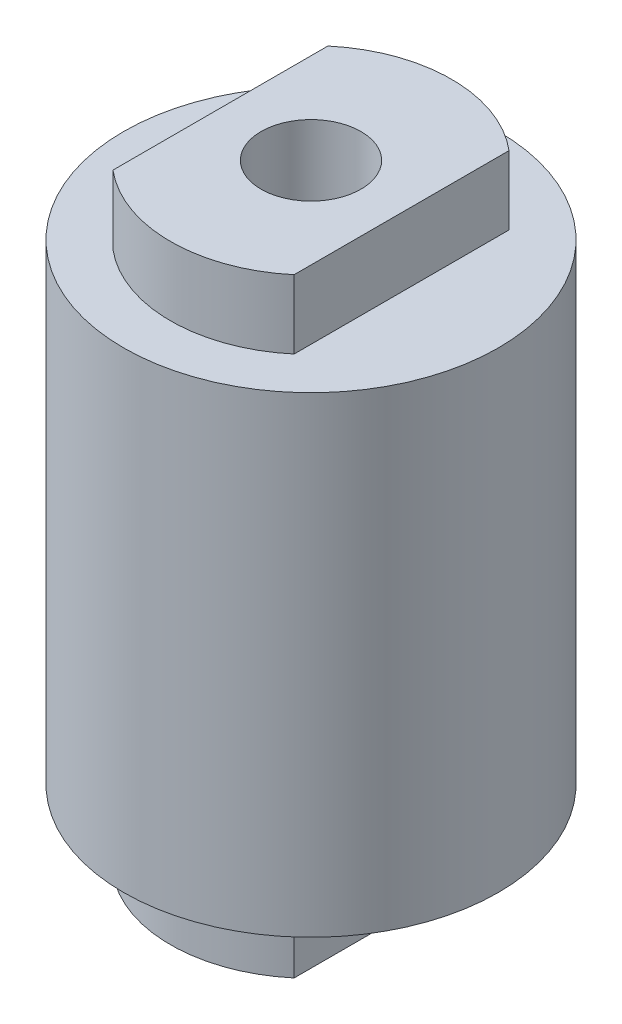
ISO-10303-21;
HEADER;
FILE_DESCRIPTION(('STEP AP214'),'2;1');
FILE_NAME('part.step','',(''),(''),'','','');
FILE_SCHEMA(('AUTOMOTIVE_DESIGN { 1 0 10303 214 1 1 1 1 }'));
ENDSEC;
DATA;
#1=APPLICATION_CONTEXT('core data for automotive mechanical design processes');
#2=APPLICATION_PROTOCOL_DEFINITION('international standard','automotive_design',2000,#1);
#3=PRODUCT_CONTEXT('',#1,'mechanical');
#4=PRODUCT('Part','Part','',(#3));
#5=PRODUCT_RELATED_PRODUCT_CATEGORY('part','',(#4));
#6=PRODUCT_DEFINITION_FORMATION('','',#4);
#7=PRODUCT_DEFINITION_CONTEXT('part definition',#1,'design');
#8=PRODUCT_DEFINITION('design','',#6,#7);
#9=PRODUCT_DEFINITION_SHAPE('','',#8);
#10=(LENGTH_UNIT() NAMED_UNIT(*) SI_UNIT(.MILLI.,.METRE.));
#11=(NAMED_UNIT(*) PLANE_ANGLE_UNIT() SI_UNIT($,.RADIAN.));
#12=(NAMED_UNIT(*) SI_UNIT($,.STERADIAN.) SOLID_ANGLE_UNIT());
#13=UNCERTAINTY_MEASURE_WITH_UNIT(LENGTH_MEASURE(1.E-05),#10,'distance_accuracy_value','');
#14=(GEOMETRIC_REPRESENTATION_CONTEXT(3) GLOBAL_UNCERTAINTY_ASSIGNED_CONTEXT((#13)) GLOBAL_UNIT_ASSIGNED_CONTEXT((#10,
#11,#12)) REPRESENTATION_CONTEXT('',''));
#15=CARTESIAN_POINT('',(0.,0.,0.));
#16=DIRECTION('',(0.,0.,1.));
#17=DIRECTION('',(1.,0.,0.));
#18=AXIS2_PLACEMENT_3D('',#15,#16,#17);
#19=CARTESIAN_POINT('',(0.,9.75,0.));
#20=DIRECTION('',(0.,1.,0.));
#21=DIRECTION('',(-1.,0.,0.));
#22=AXIS2_PLACEMENT_3D('',#19,#20,#21);
#23=CYLINDRICAL_SURFACE('',#22,4.5);
#24=DIRECTION('',(0.,1.,0.));
#25=VECTOR('',#24,1.);
#26=CARTESIAN_POINT('',(-2.9,7.55,3.44093010681705));
#27=LINE('',#26,#25);
#28=CARTESIAN_POINT('',(-2.9,7.55,3.44093010681705));
#29=VERTEX_POINT('',#28);
#30=CARTESIAN_POINT('',(-2.9,9.75,3.44093010681705));
#31=VERTEX_POINT('',#30);
#32=EDGE_CURVE('E191',#29,#31,#27,.T.);
#33=ORIENTED_EDGE('',*,*,#32,.F.);
#34=CARTESIAN_POINT('',(0.,7.55,0.));
#35=DIRECTION('',(0.,1.,0.));
#36=DIRECTION('',(-1.,0.,0.));
#37=AXIS2_PLACEMENT_3D('',#34,#35,#36);
#38=CIRCLE('',#37,4.5);
#39=CARTESIAN_POINT('',(2.9,7.55,3.44093010681705));
#40=VERTEX_POINT('',#39);
#41=EDGE_CURVE('E186',#29,#40,#38,.T.);
#42=ORIENTED_EDGE('',*,*,#41,.T.);
#43=DIRECTION('',(0.,1.,0.));
#44=VECTOR('',#43,1.);
#45=CARTESIAN_POINT('',(2.9,7.55,3.44093010681705));
#46=LINE('',#45,#44);
#47=CARTESIAN_POINT('',(2.9,9.75,3.44093010681705));
#48=VERTEX_POINT('',#47);
#49=EDGE_CURVE('E189',#40,#48,#46,.T.);
#50=ORIENTED_EDGE('',*,*,#49,.T.);
#51=CARTESIAN_POINT('',(0.,9.75,0.));
#52=DIRECTION('',(0.,1.,0.));
#53=DIRECTION('',(-1.,0.,0.));
#54=AXIS2_PLACEMENT_3D('',#51,#52,#53);
#55=CIRCLE('',#54,4.5);
#56=EDGE_CURVE('E218',#31,#48,#55,.T.);
#57=ORIENTED_EDGE('',*,*,#56,.F.);
#58=EDGE_LOOP('',(#33,#42,#50,#57));
#59=FACE_BOUND('',#58,.T.);
#60=ADVANCED_FACE('F49',(#59),#23,.T.);
#61=DIRECTION('',(0.,1.,0.));
#62=VECTOR('',#61,1.);
#63=CARTESIAN_POINT('',(2.9,7.55,-3.44093010681705));
#64=LINE('',#63,#62);
#65=CARTESIAN_POINT('',(2.9,7.55,-3.44093010681705));
#66=VERTEX_POINT('',#65);
#67=CARTESIAN_POINT('',(2.9,9.75,-3.44093010681705));
#68=VERTEX_POINT('',#67);
#69=EDGE_CURVE('E207',#66,#68,#64,.T.);
#70=ORIENTED_EDGE('',*,*,#69,.F.);
#71=CARTESIAN_POINT('',(-2.9,7.55,-3.44093010681705));
#72=VERTEX_POINT('',#71);
#73=EDGE_CURVE('E197',#66,#72,#38,.T.);
#74=ORIENTED_EDGE('',*,*,#73,.T.);
#75=DIRECTION('',(0.,1.,0.));
#76=VECTOR('',#75,1.);
#77=CARTESIAN_POINT('',(-2.9,7.55,-3.44093010681705));
#78=LINE('',#77,#76);
#79=CARTESIAN_POINT('',(-2.9,9.75,-3.44093010681705));
#80=VERTEX_POINT('',#79);
#81=EDGE_CURVE('E216',#72,#80,#78,.T.);
#82=ORIENTED_EDGE('',*,*,#81,.T.);
#83=EDGE_CURVE('E219',#68,#80,#55,.T.);
#84=ORIENTED_EDGE('',*,*,#83,.F.);
#85=EDGE_LOOP('',(#70,#74,#82,#84));
#86=FACE_BOUND('',#85,.T.);
#87=ADVANCED_FACE('F396',(#86),#23,.T.);
#88=DIRECTION('',(0.,-1.,0.));
#89=VECTOR('',#88,1.);
#90=CARTESIAN_POINT('',(2.9,-7.55,3.44093010681705));
#91=LINE('',#90,#89);
#92=CARTESIAN_POINT('',(2.9,-7.55,3.44093010681705));
#93=VERTEX_POINT('',#92);
#94=CARTESIAN_POINT('',(2.9,-9.74999999999999,3.44093010681705));
#95=VERTEX_POINT('',#94);
#96=EDGE_CURVE('E72',#93,#95,#91,.T.);
#97=ORIENTED_EDGE('',*,*,#96,.F.);
#98=CARTESIAN_POINT('',(0.,-7.55,0.));
#99=DIRECTION('',(0.,-1.,0.));
#100=DIRECTION('',(1.,0.,0.));
#101=AXIS2_PLACEMENT_3D('',#98,#99,#100);
#102=CIRCLE('',#101,4.5);
#103=CARTESIAN_POINT('',(-2.9,-7.55,3.44093010681705));
#104=VERTEX_POINT('',#103);
#105=EDGE_CURVE('E359',#104,#93,#102,.F.);
#106=ORIENTED_EDGE('',*,*,#105,.F.);
#107=DIRECTION('',(0.,-1.,0.));
#108=VECTOR('',#107,1.);
#109=CARTESIAN_POINT('',(-2.9,-7.55,3.44093010681705));
#110=LINE('',#109,#108);
#111=CARTESIAN_POINT('',(-2.9,-9.75,3.44093010681705));
#112=VERTEX_POINT('',#111);
#113=EDGE_CURVE('E296',#104,#112,#110,.T.);
#114=ORIENTED_EDGE('',*,*,#113,.T.);
#115=CARTESIAN_POINT('',(0.,-9.75,0.));
#116=DIRECTION('',(0.,1.,0.));
#117=DIRECTION('',(-1.,0.,0.));
#118=AXIS2_PLACEMENT_3D('',#115,#116,#117);
#119=CIRCLE('',#118,4.5);
#120=EDGE_CURVE('E12',#112,#95,#119,.T.);
#121=ORIENTED_EDGE('',*,*,#120,.T.);
#122=EDGE_LOOP('',(#97,#106,#114,#121));
#123=FACE_BOUND('',#122,.T.);
#124=ADVANCED_FACE('F374',(#123),#23,.T.);
#125=CARTESIAN_POINT('',(0.,-9.75,0.));
#126=DIRECTION('',(0.,1.,0.));
#127=DIRECTION('',(-1.,0.,0.));
#128=AXIS2_PLACEMENT_3D('',#125,#126,#127);
#129=CYLINDRICAL_SURFACE('',#128,1.6);
#130=CARTESIAN_POINT('',(0.,2.75,0.));
#131=DIRECTION('',(0.,1.,0.));
#132=DIRECTION('',(-1.,0.,0.));
#133=AXIS2_PLACEMENT_3D('',#130,#131,#132);
#134=CIRCLE('',#133,1.6);
#135=CARTESIAN_POINT('',(-1.6,2.75,0.));
#136=VERTEX_POINT('',#135);
#137=EDGE_CURVE('E269',#136,#136,#134,.F.);
#138=ORIENTED_EDGE('',*,*,#137,.F.);
#139=EDGE_LOOP('',(#138));
#140=FACE_BOUND('',#139,.T.);
#141=CARTESIAN_POINT('',(0.,-2.75,0.));
#142=DIRECTION('',(0.,1.,0.));
#143=DIRECTION('',(-1.,0.,0.));
#144=AXIS2_PLACEMENT_3D('',#141,#142,#143);
#145=CIRCLE('',#144,1.6);
#146=CARTESIAN_POINT('',(-1.6,-2.75,0.));
#147=VERTEX_POINT('',#146);
#148=EDGE_CURVE('E334',#147,#147,#145,.F.);
#149=ORIENTED_EDGE('',*,*,#148,.T.);
#150=EDGE_LOOP('',(#149));
#151=FACE_BOUND('',#150,.T.);
#152=ADVANCED_FACE('F382',(#140,#151),#129,.F.);
#153=DIRECTION('',(0.,-1.,0.));
#154=VECTOR('',#153,1.);
#155=CARTESIAN_POINT('',(-2.9,-7.55,-3.44093010681705));
#156=LINE('',#155,#154);
#157=CARTESIAN_POINT('',(-2.9,-7.55,-3.44093010681705));
#158=VERTEX_POINT('',#157);
#159=CARTESIAN_POINT('',(-2.9,-9.75,-3.44093010681705));
#160=VERTEX_POINT('',#159);
#161=EDGE_CURVE('E64',#158,#160,#156,.T.);
#162=ORIENTED_EDGE('',*,*,#161,.F.);
#163=CARTESIAN_POINT('',(2.9,-7.55,-3.44093010681705));
#164=VERTEX_POINT('',#163);
#165=EDGE_CURVE('E337',#164,#158,#102,.F.);
#166=ORIENTED_EDGE('',*,*,#165,.F.);
#167=DIRECTION('',(0.,-1.,0.));
#168=VECTOR('',#167,1.);
#169=CARTESIAN_POINT('',(2.9,-7.55,-3.44093010681705));
#170=LINE('',#169,#168);
#171=CARTESIAN_POINT('',(2.9,-9.75,-3.44093010681705));
#172=VERTEX_POINT('',#171);
#173=EDGE_CURVE('E287',#164,#172,#170,.T.);
#174=ORIENTED_EDGE('',*,*,#173,.T.);
#175=EDGE_CURVE('E57',#172,#160,#119,.T.);
#176=ORIENTED_EDGE('',*,*,#175,.T.);
#177=EDGE_LOOP('',(#162,#166,#174,#176));
#178=FACE_BOUND('',#177,.T.);
#179=ADVANCED_FACE('F380',(#178),#23,.T.);
#180=CARTESIAN_POINT('',(0.,-9.75,0.));
#181=DIRECTION('',(0.,1.,0.));
#182=DIRECTION('',(-1.,0.,0.));
#183=AXIS2_PLACEMENT_3D('',#180,#181,#182);
#184=PLANE('',#183);
#185=CARTESIAN_POINT('',(0.,-9.75,0.));
#186=DIRECTION('',(0.,1.,0.));
#187=DIRECTION('',(-1.,0.,0.));
#188=AXIS2_PLACEMENT_3D('',#185,#186,#187);
#189=CIRCLE('',#188,1.6);
#190=CARTESIAN_POINT('',(-1.6,-9.75,0.));
#191=VERTEX_POINT('',#190);
#192=EDGE_CURVE('E213',#191,#191,#189,.T.);
#193=ORIENTED_EDGE('',*,*,#192,.T.);
#194=EDGE_LOOP('',(#193));
#195=FACE_BOUND('',#194,.T.);
#196=ORIENTED_EDGE('',*,*,#120,.F.);
#197=DIRECTION('',(0.,0.,1.));
#198=VECTOR('',#197,1.);
#199=CARTESIAN_POINT('',(-2.9,-9.75,0.));
#200=LINE('',#199,#198);
#201=EDGE_CURVE('E291',#160,#112,#200,.T.);
#202=ORIENTED_EDGE('',*,*,#201,.F.);
#203=ORIENTED_EDGE('',*,*,#175,.F.);
#204=DIRECTION('',(0.,0.,1.));
#205=VECTOR('',#204,1.);
#206=CARTESIAN_POINT('',(2.9,-9.75,0.));
#207=LINE('',#206,#205);
#208=EDGE_CURVE('E292',#172,#95,#207,.T.);
#209=ORIENTED_EDGE('',*,*,#208,.T.);
#210=EDGE_LOOP('',(#196,#202,#203,#209));
#211=FACE_BOUND('',#210,.T.);
#212=ADVANCED_FACE('F51',(#195,#211),#184,.F.);
#213=CARTESIAN_POINT('',(0.,-5.4,0.));
#214=DIRECTION('',(0.,1.,0.));
#215=DIRECTION('',(-1.,0.,0.));
#216=AXIS2_PLACEMENT_3D('',#213,#214,#215);
#217=CIRCLE('',#216,1.6);
#218=CARTESIAN_POINT('',(-1.6,-5.4,0.));
#219=VERTEX_POINT('',#218);
#220=EDGE_CURVE('E318',#219,#219,#217,.F.);
#221=ORIENTED_EDGE('',*,*,#220,.F.);
#222=EDGE_LOOP('',(#221));
#223=FACE_BOUND('',#222,.T.);
#224=ORIENTED_EDGE('',*,*,#192,.F.);
#225=EDGE_LOOP('',(#224));
#226=FACE_BOUND('',#225,.T.);
#227=ADVANCED_FACE('F388',(#223,#226),#129,.F.);
#228=CARTESIAN_POINT('',(4.5,9.75,0.));
#229=DIRECTION('',(0.,-1.,0.));
#230=DIRECTION('',(1.,0.,0.));
#231=AXIS2_PLACEMENT_3D('',#228,#229,#230);
#232=PLANE('',#231);
#233=CARTESIAN_POINT('',(0.,9.75,0.));
#234=DIRECTION('',(0.,1.,0.));
#235=DIRECTION('',(-1.,0.,0.));
#236=AXIS2_PLACEMENT_3D('',#233,#234,#235);
#237=CIRCLE('',#236,1.6);
#238=CARTESIAN_POINT('',(-1.6,9.75,0.));
#239=VERTEX_POINT('',#238);
#240=EDGE_CURVE('E231',#239,#239,#237,.T.);
#241=ORIENTED_EDGE('',*,*,#240,.F.);
#242=EDGE_LOOP('',(#241));
#243=FACE_BOUND('',#242,.T.);
#244=DIRECTION('',(0.,0.,1.));
#245=VECTOR('',#244,1.);
#246=CARTESIAN_POINT('',(-2.9,9.75,0.));
#247=LINE('',#246,#245);
#248=EDGE_CURVE('E206',#80,#31,#247,.T.);
#249=ORIENTED_EDGE('',*,*,#248,.T.);
#250=ORIENTED_EDGE('',*,*,#56,.T.);
#251=DIRECTION('',(0.,0.,1.));
#252=VECTOR('',#251,1.);
#253=CARTESIAN_POINT('',(2.9,9.75,0.));
#254=LINE('',#253,#252);
#255=EDGE_CURVE('E205',#68,#48,#254,.T.);
#256=ORIENTED_EDGE('',*,*,#255,.F.);
#257=ORIENTED_EDGE('',*,*,#83,.T.);
#258=EDGE_LOOP('',(#249,#250,#256,#257));
#259=FACE_BOUND('',#258,.T.);
#260=ADVANCED_FACE('F404',(#243,#259),#232,.F.);
#261=CARTESIAN_POINT('',(2.9,7.55,0.));
#262=DIRECTION('',(-1.,0.,0.));
#263=DIRECTION('',(0.,-1.,0.));
#264=AXIS2_PLACEMENT_3D('',#261,#262,#263);
#265=PLANE('',#264);
#266=ORIENTED_EDGE('',*,*,#255,.T.);
#267=ORIENTED_EDGE('',*,*,#49,.F.);
#268=DIRECTION('',(0.,0.,1.));
#269=VECTOR('',#268,1.);
#270=CARTESIAN_POINT('',(2.9,7.55,0.));
#271=LINE('',#270,#269);
#272=EDGE_CURVE('E202',#66,#40,#271,.T.);
#273=ORIENTED_EDGE('',*,*,#272,.F.);
#274=ORIENTED_EDGE('',*,*,#69,.T.);
#275=EDGE_LOOP('',(#266,#267,#273,#274));
#276=FACE_BOUND('',#275,.T.);
#277=ADVANCED_FACE('F201',(#276),#265,.F.);
#278=CARTESIAN_POINT('',(-2.9,7.55,0.));
#279=DIRECTION('',(-1.,0.,0.));
#280=DIRECTION('',(0.,-1.,0.));
#281=AXIS2_PLACEMENT_3D('',#278,#279,#280);
#282=PLANE('',#281);
#283=ORIENTED_EDGE('',*,*,#248,.F.);
#284=ORIENTED_EDGE('',*,*,#81,.F.);
#285=DIRECTION('',(0.,0.,1.));
#286=VECTOR('',#285,1.);
#287=CARTESIAN_POINT('',(-2.9,7.55,0.));
#288=LINE('',#287,#286);
#289=EDGE_CURVE('E227',#72,#29,#288,.T.);
#290=ORIENTED_EDGE('',*,*,#289,.T.);
#291=ORIENTED_EDGE('',*,*,#32,.T.);
#292=EDGE_LOOP('',(#283,#284,#290,#291));
#293=FACE_BOUND('',#292,.T.);
#294=ADVANCED_FACE('F410',(#293),#282,.T.);
#295=CARTESIAN_POINT('',(0.,7.55,0.));
#296=DIRECTION('',(0.,1.,0.));
#297=DIRECTION('',(-1.,0.,0.));
#298=AXIS2_PLACEMENT_3D('',#295,#296,#297);
#299=PLANE('',#298);
#300=ORIENTED_EDGE('',*,*,#289,.F.);
#301=ORIENTED_EDGE('',*,*,#73,.F.);
#302=ORIENTED_EDGE('',*,*,#272,.T.);
#303=ORIENTED_EDGE('',*,*,#41,.F.);
#304=EDGE_LOOP('',(#300,#301,#302,#303));
#305=FACE_BOUND('',#304,.T.);
#306=CARTESIAN_POINT('',(0.,7.55,0.));
#307=DIRECTION('',(0.,1.,0.));
#308=DIRECTION('',(-1.,0.,0.));
#309=AXIS2_PLACEMENT_3D('',#306,#307,#308);
#310=CIRCLE('',#309,6.);
#311=CARTESIAN_POINT('',(-6.,7.55,0.));
#312=VERTEX_POINT('',#311);
#313=EDGE_CURVE('E196',#312,#312,#310,.T.);
#314=ORIENTED_EDGE('',*,*,#313,.T.);
#315=EDGE_LOOP('',(#314));
#316=FACE_BOUND('',#315,.T.);
#317=ADVANCED_FACE('F209',(#305,#316),#299,.T.);
#318=CARTESIAN_POINT('',(0.,5.4,0.));
#319=DIRECTION('',(0.,1.,0.));
#320=DIRECTION('',(-1.,0.,0.));
#321=AXIS2_PLACEMENT_3D('',#318,#319,#320);
#322=CIRCLE('',#321,1.6);
#323=CARTESIAN_POINT('',(-1.6,5.4,0.));
#324=VERTEX_POINT('',#323);
#325=EDGE_CURVE('E257',#324,#324,#322,.F.);
#326=ORIENTED_EDGE('',*,*,#325,.T.);
#327=EDGE_LOOP('',(#326));
#328=FACE_BOUND('',#327,.T.);
#329=ORIENTED_EDGE('',*,*,#240,.T.);
#330=EDGE_LOOP('',(#329));
#331=FACE_BOUND('',#330,.T.);
#332=ADVANCED_FACE('F393',(#328,#331),#129,.F.);
#333=CARTESIAN_POINT('',(0.,5.4,-2.95));
#334=DIRECTION('',(0.,0.,1.));
#335=DIRECTION('',(1.,0.,0.));
#336=AXIS2_PLACEMENT_3D('',#333,#334,#335);
#337=PLANE('',#336);
#338=DIRECTION('',(-1.,0.,0.));
#339=VECTOR('',#338,1.);
#340=CARTESIAN_POINT('',(0.,2.75,-2.95));
#341=LINE('',#340,#339);
#342=CARTESIAN_POINT('',(1.70318329410939,2.75,-2.95));
#343=VERTEX_POINT('',#342);
#344=CARTESIAN_POINT('',(-1.7031832941094,2.75,-2.95));
#345=VERTEX_POINT('',#344);
#346=EDGE_CURVE('E266',#343,#345,#341,.T.);
#347=ORIENTED_EDGE('',*,*,#346,.F.);
#348=DIRECTION('',(0.,-1.,0.));
#349=VECTOR('',#348,1.);
#350=CARTESIAN_POINT('',(1.70318329410939,5.4,-2.95));
#351=LINE('',#350,#349);
#352=CARTESIAN_POINT('',(1.70318329410939,5.4,-2.95));
#353=VERTEX_POINT('',#352);
#354=EDGE_CURVE('E251',#353,#343,#351,.T.);
#355=ORIENTED_EDGE('',*,*,#354,.F.);
#356=DIRECTION('',(-1.,0.,0.));
#357=VECTOR('',#356,1.);
#358=CARTESIAN_POINT('',(0.,5.4,-2.95));
#359=LINE('',#358,#357);
#360=CARTESIAN_POINT('',(-1.7031832941094,5.4,-2.95));
#361=VERTEX_POINT('',#360);
#362=EDGE_CURVE('E281',#353,#361,#359,.T.);
#363=ORIENTED_EDGE('',*,*,#362,.T.);
#364=DIRECTION('',(0.,-1.,0.));
#365=VECTOR('',#364,1.);
#366=CARTESIAN_POINT('',(-1.7031832941094,5.4,-2.95));
#367=LINE('',#366,#365);
#368=EDGE_CURVE('E234',#361,#345,#367,.T.);
#369=ORIENTED_EDGE('',*,*,#368,.T.);
#370=EDGE_LOOP('',(#347,#355,#363,#369));
#371=FACE_BOUND('',#370,.T.);
#372=ADVANCED_FACE('F420',(#371),#337,.T.);
#373=CARTESIAN_POINT('',(-2.5547749411641,5.4,-1.475));
#374=DIRECTION('',(0.866025403784439,0.,0.5));
#375=DIRECTION('',(0.5,0.,-0.866025403784439));
#376=AXIS2_PLACEMENT_3D('',#373,#374,#375);
#377=PLANE('',#376);
#378=DIRECTION('',(-0.5,0.,0.866025403784439));
#379=VECTOR('',#378,1.);
#380=CARTESIAN_POINT('',(-2.5547749411641,2.75,-1.475));
#381=LINE('',#380,#379);
#382=CARTESIAN_POINT('',(-3.4063665882188,2.75,0.));
#383=VERTEX_POINT('',#382);
#384=EDGE_CURVE('E264',#345,#383,#381,.T.);
#385=ORIENTED_EDGE('',*,*,#384,.F.);
#386=ORIENTED_EDGE('',*,*,#368,.F.);
#387=DIRECTION('',(-0.5,0.,0.866025403784439));
#388=VECTOR('',#387,1.);
#389=CARTESIAN_POINT('',(-2.5547749411641,5.4,-1.475));
#390=LINE('',#389,#388);
#391=CARTESIAN_POINT('',(-3.4063665882188,5.4,0.));
#392=VERTEX_POINT('',#391);
#393=EDGE_CURVE('E279',#361,#392,#390,.T.);
#394=ORIENTED_EDGE('',*,*,#393,.T.);
#395=DIRECTION('',(0.,-1.,0.));
#396=VECTOR('',#395,1.);
#397=CARTESIAN_POINT('',(-3.4063665882188,5.4,0.));
#398=LINE('',#397,#396);
#399=EDGE_CURVE('E239',#392,#383,#398,.T.);
#400=ORIENTED_EDGE('',*,*,#399,.T.);
#401=EDGE_LOOP('',(#385,#386,#394,#400));
#402=FACE_BOUND('',#401,.T.);
#403=ADVANCED_FACE('F424',(#402),#377,.T.);
#404=CARTESIAN_POINT('',(-2.5547749411641,5.4,1.475));
#405=DIRECTION('',(0.866025403784439,0.,-0.5));
#406=DIRECTION('',(-0.5,0.,-0.866025403784438));
#407=AXIS2_PLACEMENT_3D('',#404,#405,#406);
#408=PLANE('',#407);
#409=DIRECTION('',(0.5,0.,0.866025403784439));
#410=VECTOR('',#409,1.);
#411=CARTESIAN_POINT('',(-2.5547749411641,2.75,1.475));
#412=LINE('',#411,#410);
#413=CARTESIAN_POINT('',(-1.7031832941094,2.75,2.95));
#414=VERTEX_POINT('',#413);
#415=EDGE_CURVE('E262',#383,#414,#412,.T.);
#416=ORIENTED_EDGE('',*,*,#415,.F.);
#417=ORIENTED_EDGE('',*,*,#399,.F.);
#418=DIRECTION('',(0.5,0.,0.866025403784439));
#419=VECTOR('',#418,1.);
#420=CARTESIAN_POINT('',(-2.5547749411641,5.4,1.475));
#421=LINE('',#420,#419);
#422=CARTESIAN_POINT('',(-1.7031832941094,5.4,2.95));
#423=VERTEX_POINT('',#422);
#424=EDGE_CURVE('E277',#392,#423,#421,.T.);
#425=ORIENTED_EDGE('',*,*,#424,.T.);
#426=DIRECTION('',(0.,-1.,0.));
#427=VECTOR('',#426,1.);
#428=CARTESIAN_POINT('',(-1.7031832941094,5.4,2.95));
#429=LINE('',#428,#427);
#430=EDGE_CURVE('E242',#423,#414,#429,.T.);
#431=ORIENTED_EDGE('',*,*,#430,.T.);
#432=EDGE_LOOP('',(#416,#417,#425,#431));
#433=FACE_BOUND('',#432,.T.);
#434=ADVANCED_FACE('F428',(#433),#408,.T.);
#435=CARTESIAN_POINT('',(0.,5.4,2.95));
#436=DIRECTION('',(0.,0.,-1.));
#437=DIRECTION('',(-1.,0.,0.));
#438=AXIS2_PLACEMENT_3D('',#435,#436,#437);
#439=PLANE('',#438);
#440=DIRECTION('',(1.,0.,0.));
#441=VECTOR('',#440,1.);
#442=CARTESIAN_POINT('',(0.,2.75,2.95));
#443=LINE('',#442,#441);
#444=CARTESIAN_POINT('',(1.7031832941094,2.75,2.95));
#445=VERTEX_POINT('',#444);
#446=EDGE_CURVE('E260',#414,#445,#443,.T.);
#447=ORIENTED_EDGE('',*,*,#446,.F.);
#448=ORIENTED_EDGE('',*,*,#430,.F.);
#449=DIRECTION('',(1.,0.,0.));
#450=VECTOR('',#449,1.);
#451=CARTESIAN_POINT('',(0.,5.4,2.95));
#452=LINE('',#451,#450);
#453=CARTESIAN_POINT('',(1.70318329410939,5.4,2.95));
#454=VERTEX_POINT('',#453);
#455=EDGE_CURVE('E275',#423,#454,#452,.T.);
#456=ORIENTED_EDGE('',*,*,#455,.T.);
#457=DIRECTION('',(0.,-1.,0.));
#458=VECTOR('',#457,1.);
#459=CARTESIAN_POINT('',(1.70318329410939,5.4,2.95));
#460=LINE('',#459,#458);
#461=EDGE_CURVE('E245',#454,#445,#460,.T.);
#462=ORIENTED_EDGE('',*,*,#461,.T.);
#463=EDGE_LOOP('',(#447,#448,#456,#462));
#464=FACE_BOUND('',#463,.T.);
#465=ADVANCED_FACE('F432',(#464),#439,.T.);
#466=CARTESIAN_POINT('',(2.55477494116409,5.4,1.475));
#467=DIRECTION('',(-0.866025403784439,0.,-0.5));
#468=DIRECTION('',(-0.5,0.,0.866025403784439));
#469=AXIS2_PLACEMENT_3D('',#466,#467,#468);
#470=PLANE('',#469);
#471=DIRECTION('',(0.5,0.,-0.866025403784439));
#472=VECTOR('',#471,1.);
#473=CARTESIAN_POINT('',(2.55477494116409,2.75,1.475));
#474=LINE('',#473,#472);
#475=CARTESIAN_POINT('',(3.40636658821879,2.75,0.));
#476=VERTEX_POINT('',#475);
#477=EDGE_CURVE('E258',#445,#476,#474,.T.);
#478=ORIENTED_EDGE('',*,*,#477,.F.);
#479=ORIENTED_EDGE('',*,*,#461,.F.);
#480=DIRECTION('',(0.5,0.,-0.866025403784439));
#481=VECTOR('',#480,1.);
#482=CARTESIAN_POINT('',(2.55477494116409,5.4,1.475));
#483=LINE('',#482,#481);
#484=CARTESIAN_POINT('',(3.40636658821879,5.4,0.));
#485=VERTEX_POINT('',#484);
#486=EDGE_CURVE('E273',#454,#485,#483,.T.);
#487=ORIENTED_EDGE('',*,*,#486,.T.);
#488=DIRECTION('',(0.,-1.,0.));
#489=VECTOR('',#488,1.);
#490=CARTESIAN_POINT('',(3.40636658821879,5.4,0.));
#491=LINE('',#490,#489);
#492=EDGE_CURVE('E248',#485,#476,#491,.T.);
#493=ORIENTED_EDGE('',*,*,#492,.T.);
#494=EDGE_LOOP('',(#478,#479,#487,#493));
#495=FACE_BOUND('',#494,.T.);
#496=ADVANCED_FACE('F436',(#495),#470,.T.);
#497=CARTESIAN_POINT('',(2.55477494116409,5.4,-1.475));
#498=DIRECTION('',(-0.866025403784439,0.,0.5));
#499=DIRECTION('',(0.5,0.,0.866025403784439));
#500=AXIS2_PLACEMENT_3D('',#497,#498,#499);
#501=PLANE('',#500);
#502=DIRECTION('',(-0.5,0.,-0.866025403784439));
#503=VECTOR('',#502,1.);
#504=CARTESIAN_POINT('',(2.55477494116409,2.75,-1.475));
#505=LINE('',#504,#503);
#506=EDGE_CURVE('E255',#476,#343,#505,.T.);
#507=ORIENTED_EDGE('',*,*,#506,.F.);
#508=ORIENTED_EDGE('',*,*,#492,.F.);
#509=DIRECTION('',(-0.5,0.,-0.866025403784439));
#510=VECTOR('',#509,1.);
#511=CARTESIAN_POINT('',(2.55477494116409,5.4,-1.475));
#512=LINE('',#511,#510);
#513=EDGE_CURVE('E254',#485,#353,#512,.T.);
#514=ORIENTED_EDGE('',*,*,#513,.T.);
#515=ORIENTED_EDGE('',*,*,#354,.T.);
#516=EDGE_LOOP('',(#507,#508,#514,#515));
#517=FACE_BOUND('',#516,.T.);
#518=ADVANCED_FACE('F440',(#517),#501,.T.);
#519=CARTESIAN_POINT('',(0.,5.4,0.));
#520=DIRECTION('',(0.,1.,0.));
#521=DIRECTION('',(-1.,0.,0.));
#522=AXIS2_PLACEMENT_3D('',#519,#520,#521);
#523=PLANE('',#522);
#524=ORIENTED_EDGE('',*,*,#325,.F.);
#525=EDGE_LOOP('',(#524));
#526=FACE_BOUND('',#525,.T.);
#527=ORIENTED_EDGE('',*,*,#362,.F.);
#528=ORIENTED_EDGE('',*,*,#513,.F.);
#529=ORIENTED_EDGE('',*,*,#486,.F.);
#530=ORIENTED_EDGE('',*,*,#455,.F.);
#531=ORIENTED_EDGE('',*,*,#424,.F.);
#532=ORIENTED_EDGE('',*,*,#393,.F.);
#533=EDGE_LOOP('',(#527,#528,#529,#530,#531,#532));
#534=FACE_BOUND('',#533,.T.);
#535=ADVANCED_FACE('F444',(#526,#534),#523,.F.);
#536=CARTESIAN_POINT('',(0.,2.75,0.));
#537=DIRECTION('',(0.,1.,0.));
#538=DIRECTION('',(-1.,0.,0.));
#539=AXIS2_PLACEMENT_3D('',#536,#537,#538);
#540=PLANE('',#539);
#541=ORIENTED_EDGE('',*,*,#137,.T.);
#542=EDGE_LOOP('',(#541));
#543=FACE_BOUND('',#542,.T.);
#544=ORIENTED_EDGE('',*,*,#346,.T.);
#545=ORIENTED_EDGE('',*,*,#384,.T.);
#546=ORIENTED_EDGE('',*,*,#415,.T.);
#547=ORIENTED_EDGE('',*,*,#446,.T.);
#548=ORIENTED_EDGE('',*,*,#477,.T.);
#549=ORIENTED_EDGE('',*,*,#506,.T.);
#550=EDGE_LOOP('',(#544,#545,#546,#547,#548,#549));
#551=FACE_BOUND('',#550,.T.);
#552=ADVANCED_FACE('F446',(#543,#551),#540,.T.);
#553=CARTESIAN_POINT('',(2.9,-7.55,0.));
#554=DIRECTION('',(1.,0.,0.));
#555=DIRECTION('',(0.,1.,0.));
#556=AXIS2_PLACEMENT_3D('',#553,#554,#555);
#557=PLANE('',#556);
#558=ORIENTED_EDGE('',*,*,#208,.F.);
#559=ORIENTED_EDGE('',*,*,#173,.F.);
#560=DIRECTION('',(0.,0.,1.));
#561=VECTOR('',#560,1.);
#562=CARTESIAN_POINT('',(2.9,-7.55,0.));
#563=LINE('',#562,#561);
#564=EDGE_CURVE('E288',#164,#93,#563,.T.);
#565=ORIENTED_EDGE('',*,*,#564,.T.);
#566=ORIENTED_EDGE('',*,*,#96,.T.);
#567=EDGE_LOOP('',(#558,#559,#565,#566));
#568=FACE_BOUND('',#567,.T.);
#569=ADVANCED_FACE('F378',(#568),#557,.T.);
#570=CARTESIAN_POINT('',(-2.9,-7.55,0.));
#571=DIRECTION('',(1.,0.,0.));
#572=DIRECTION('',(0.,1.,0.));
#573=AXIS2_PLACEMENT_3D('',#570,#571,#572);
#574=PLANE('',#573);
#575=ORIENTED_EDGE('',*,*,#201,.T.);
#576=ORIENTED_EDGE('',*,*,#113,.F.);
#577=DIRECTION('',(0.,0.,1.));
#578=VECTOR('',#577,1.);
#579=CARTESIAN_POINT('',(-2.9,-7.55,0.));
#580=LINE('',#579,#578);
#581=EDGE_CURVE('E299',#158,#104,#580,.T.);
#582=ORIENTED_EDGE('',*,*,#581,.F.);
#583=ORIENTED_EDGE('',*,*,#161,.T.);
#584=EDGE_LOOP('',(#575,#576,#582,#583));
#585=FACE_BOUND('',#584,.T.);
#586=ADVANCED_FACE('F455',(#585),#574,.F.);
#587=CARTESIAN_POINT('',(0.,-7.55,0.));
#588=DIRECTION('',(0.,-1.,0.));
#589=DIRECTION('',(-1.,0.,0.));
#590=AXIS2_PLACEMENT_3D('',#587,#588,#589);
#591=PLANE('',#590);
#592=ORIENTED_EDGE('',*,*,#581,.T.);
#593=ORIENTED_EDGE('',*,*,#105,.T.);
#594=ORIENTED_EDGE('',*,*,#564,.F.);
#595=ORIENTED_EDGE('',*,*,#165,.T.);
#596=EDGE_LOOP('',(#592,#593,#594,#595));
#597=FACE_BOUND('',#596,.T.);
#598=CARTESIAN_POINT('',(0.,-7.55,0.));
#599=DIRECTION('',(0.,-1.,0.));
#600=DIRECTION('',(1.,0.,0.));
#601=AXIS2_PLACEMENT_3D('',#598,#599,#600);
#602=CIRCLE('',#601,6.);
#603=CARTESIAN_POINT('',(6.,-7.55,0.));
#604=VERTEX_POINT('',#603);
#605=EDGE_CURVE('E360',#604,#604,#602,.F.);
#606=ORIENTED_EDGE('',*,*,#605,.F.);
#607=EDGE_LOOP('',(#606));
#608=FACE_BOUND('',#607,.T.);
#609=ADVANCED_FACE('F369',(#597,#608),#591,.T.);
#610=CARTESIAN_POINT('',(0.,-5.4,-2.95));
#611=DIRECTION('',(0.,0.,-1.));
#612=DIRECTION('',(-1.,0.,0.));
#613=AXIS2_PLACEMENT_3D('',#610,#611,#612);
#614=PLANE('',#613);
#615=DIRECTION('',(-1.,0.,0.));
#616=VECTOR('',#615,1.);
#617=CARTESIAN_POINT('',(0.,-2.75,-2.95));
#618=LINE('',#617,#616);
#619=CARTESIAN_POINT('',(1.70318329410939,-2.75,-2.95));
#620=VERTEX_POINT('',#619);
#621=CARTESIAN_POINT('',(-1.7031832941094,-2.75,-2.95));
#622=VERTEX_POINT('',#621);
#623=EDGE_CURVE('E331',#620,#622,#618,.T.);
#624=ORIENTED_EDGE('',*,*,#623,.T.);
#625=DIRECTION('',(0.,1.,0.));
#626=VECTOR('',#625,1.);
#627=CARTESIAN_POINT('',(-1.7031832941094,-5.4,-2.95));
#628=LINE('',#627,#626);
#629=CARTESIAN_POINT('',(-1.7031832941094,-5.4,-2.95));
#630=VERTEX_POINT('',#629);
#631=EDGE_CURVE('E312',#630,#622,#628,.T.);
#632=ORIENTED_EDGE('',*,*,#631,.F.);
#633=DIRECTION('',(-1.,0.,0.));
#634=VECTOR('',#633,1.);
#635=CARTESIAN_POINT('',(0.,-5.4,-2.95));
#636=LINE('',#635,#634);
#637=CARTESIAN_POINT('',(1.70318329410939,-5.4,-2.95));
#638=VERTEX_POINT('',#637);
#639=EDGE_CURVE('E352',#638,#630,#636,.T.);
#640=ORIENTED_EDGE('',*,*,#639,.F.);
#641=DIRECTION('',(0.,1.,0.));
#642=VECTOR('',#641,1.);
#643=CARTESIAN_POINT('',(1.70318329410939,-5.4,-2.95));
#644=LINE('',#643,#642);
#645=EDGE_CURVE('E294',#638,#620,#644,.T.);
#646=ORIENTED_EDGE('',*,*,#645,.T.);
#647=EDGE_LOOP('',(#624,#632,#640,#646));
#648=FACE_BOUND('',#647,.T.);
#649=ADVANCED_FACE('F460',(#648),#614,.F.);
#650=CARTESIAN_POINT('',(2.55477494116409,-5.4,-1.475));
#651=DIRECTION('',(0.866025403784439,0.,-0.5));
#652=DIRECTION('',(-0.5,0.,-0.866025403784439));
#653=AXIS2_PLACEMENT_3D('',#650,#651,#652);
#654=PLANE('',#653);
#655=DIRECTION('',(-0.5,0.,-0.866025403784439));
#656=VECTOR('',#655,1.);
#657=CARTESIAN_POINT('',(2.55477494116409,-2.75,-1.475));
#658=LINE('',#657,#656);
#659=CARTESIAN_POINT('',(3.40636658821879,-2.75,0.));
#660=VERTEX_POINT('',#659);
#661=EDGE_CURVE('E328',#660,#620,#658,.T.);
#662=ORIENTED_EDGE('',*,*,#661,.T.);
#663=ORIENTED_EDGE('',*,*,#645,.F.);
#664=DIRECTION('',(-0.5,0.,-0.866025403784439));
#665=VECTOR('',#664,1.);
#666=CARTESIAN_POINT('',(2.55477494116409,-5.4,-1.475));
#667=LINE('',#666,#665);
#668=CARTESIAN_POINT('',(3.40636658821879,-5.4,0.));
#669=VERTEX_POINT('',#668);
#670=EDGE_CURVE('E349',#669,#638,#667,.T.);
#671=ORIENTED_EDGE('',*,*,#670,.F.);
#672=DIRECTION('',(0.,1.,0.));
#673=VECTOR('',#672,1.);
#674=CARTESIAN_POINT('',(3.40636658821879,-5.4,0.));
#675=LINE('',#674,#673);
#676=EDGE_CURVE('E304',#669,#660,#675,.T.);
#677=ORIENTED_EDGE('',*,*,#676,.T.);
#678=EDGE_LOOP('',(#662,#663,#671,#677));
#679=FACE_BOUND('',#678,.T.);
#680=ADVANCED_FACE('F463',(#679),#654,.F.);
#681=CARTESIAN_POINT('',(2.55477494116409,-5.4,1.475));
#682=DIRECTION('',(0.866025403784439,0.,0.5));
#683=DIRECTION('',(0.5,0.,-0.866025403784439));
#684=AXIS2_PLACEMENT_3D('',#681,#682,#683);
#685=PLANE('',#684);
#686=DIRECTION('',(0.5,0.,-0.866025403784439));
#687=VECTOR('',#686,1.);
#688=CARTESIAN_POINT('',(2.55477494116409,-2.75,1.475));
#689=LINE('',#688,#687);
#690=CARTESIAN_POINT('',(1.7031832941094,-2.75,2.95));
#691=VERTEX_POINT('',#690);
#692=EDGE_CURVE('E325',#691,#660,#689,.T.);
#693=ORIENTED_EDGE('',*,*,#692,.T.);
#694=ORIENTED_EDGE('',*,*,#676,.F.);
#695=DIRECTION('',(0.5,0.,-0.866025403784439));
#696=VECTOR('',#695,1.);
#697=CARTESIAN_POINT('',(2.55477494116409,-5.4,1.475));
#698=LINE('',#697,#696);
#699=CARTESIAN_POINT('',(1.70318329410939,-5.4,2.95));
#700=VERTEX_POINT('',#699);
#701=EDGE_CURVE('E346',#700,#669,#698,.T.);
#702=ORIENTED_EDGE('',*,*,#701,.F.);
#703=DIRECTION('',(0.,1.,0.));
#704=VECTOR('',#703,1.);
#705=CARTESIAN_POINT('',(1.70318329410939,-5.4,2.95));
#706=LINE('',#705,#704);
#707=EDGE_CURVE('E306',#700,#691,#706,.T.);
#708=ORIENTED_EDGE('',*,*,#707,.T.);
#709=EDGE_LOOP('',(#693,#694,#702,#708));
#710=FACE_BOUND('',#709,.T.);
#711=ADVANCED_FACE('F467',(#710),#685,.F.);
#712=CARTESIAN_POINT('',(0.,-5.4,2.95));
#713=DIRECTION('',(0.,0.,1.));
#714=DIRECTION('',(1.,0.,0.));
#715=AXIS2_PLACEMENT_3D('',#712,#713,#714);
#716=PLANE('',#715);
#717=DIRECTION('',(1.,0.,0.));
#718=VECTOR('',#717,1.);
#719=CARTESIAN_POINT('',(0.,-2.75,2.95));
#720=LINE('',#719,#718);
#721=CARTESIAN_POINT('',(-1.7031832941094,-2.75,2.95));
#722=VERTEX_POINT('',#721);
#723=EDGE_CURVE('E322',#722,#691,#720,.T.);
#724=ORIENTED_EDGE('',*,*,#723,.T.);
#725=ORIENTED_EDGE('',*,*,#707,.F.);
#726=DIRECTION('',(1.,0.,0.));
#727=VECTOR('',#726,1.);
#728=CARTESIAN_POINT('',(0.,-5.4,2.95));
#729=LINE('',#728,#727);
#730=CARTESIAN_POINT('',(-1.7031832941094,-5.4,2.95));
#731=VERTEX_POINT('',#730);
#732=EDGE_CURVE('E343',#731,#700,#729,.T.);
#733=ORIENTED_EDGE('',*,*,#732,.F.);
#734=DIRECTION('',(0.,1.,0.));
#735=VECTOR('',#734,1.);
#736=CARTESIAN_POINT('',(-1.7031832941094,-5.4,2.95));
#737=LINE('',#736,#735);
#738=EDGE_CURVE('E308',#731,#722,#737,.T.);
#739=ORIENTED_EDGE('',*,*,#738,.T.);
#740=EDGE_LOOP('',(#724,#725,#733,#739));
#741=FACE_BOUND('',#740,.T.);
#742=ADVANCED_FACE('F471',(#741),#716,.F.);
#743=CARTESIAN_POINT('',(-2.5547749411641,-5.4,1.475));
#744=DIRECTION('',(-0.866025403784439,0.,0.5));
#745=DIRECTION('',(0.5,0.,0.866025403784438));
#746=AXIS2_PLACEMENT_3D('',#743,#744,#745);
#747=PLANE('',#746);
#748=DIRECTION('',(0.5,0.,0.866025403784439));
#749=VECTOR('',#748,1.);
#750=CARTESIAN_POINT('',(-2.5547749411641,-2.75,1.475));
#751=LINE('',#750,#749);
#752=CARTESIAN_POINT('',(-3.4063665882188,-2.75,0.));
#753=VERTEX_POINT('',#752);
#754=EDGE_CURVE('E319',#753,#722,#751,.T.);
#755=ORIENTED_EDGE('',*,*,#754,.T.);
#756=ORIENTED_EDGE('',*,*,#738,.F.);
#757=DIRECTION('',(0.5,0.,0.866025403784439));
#758=VECTOR('',#757,1.);
#759=CARTESIAN_POINT('',(-2.5547749411641,-5.4,1.475));
#760=LINE('',#759,#758);
#761=CARTESIAN_POINT('',(-3.4063665882188,-5.4,0.));
#762=VERTEX_POINT('',#761);
#763=EDGE_CURVE('E340',#762,#731,#760,.T.);
#764=ORIENTED_EDGE('',*,*,#763,.F.);
#765=DIRECTION('',(0.,1.,0.));
#766=VECTOR('',#765,1.);
#767=CARTESIAN_POINT('',(-3.4063665882188,-5.4,0.));
#768=LINE('',#767,#766);
#769=EDGE_CURVE('E310',#762,#753,#768,.T.);
#770=ORIENTED_EDGE('',*,*,#769,.T.);
#771=EDGE_LOOP('',(#755,#756,#764,#770));
#772=FACE_BOUND('',#771,.T.);
#773=ADVANCED_FACE('F475',(#772),#747,.F.);
#774=CARTESIAN_POINT('',(-2.5547749411641,-5.4,-1.475));
#775=DIRECTION('',(-0.866025403784439,0.,-0.5));
#776=DIRECTION('',(-0.5,0.,0.866025403784439));
#777=AXIS2_PLACEMENT_3D('',#774,#775,#776);
#778=PLANE('',#777);
#779=DIRECTION('',(-0.5,0.,0.866025403784439));
#780=VECTOR('',#779,1.);
#781=CARTESIAN_POINT('',(-2.5547749411641,-2.75,-1.475));
#782=LINE('',#781,#780);
#783=EDGE_CURVE('E315',#622,#753,#782,.T.);
#784=ORIENTED_EDGE('',*,*,#783,.T.);
#785=ORIENTED_EDGE('',*,*,#769,.F.);
#786=DIRECTION('',(-0.5,0.,0.866025403784439));
#787=VECTOR('',#786,1.);
#788=CARTESIAN_POINT('',(-2.5547749411641,-5.4,-1.475));
#789=LINE('',#788,#787);
#790=EDGE_CURVE('E314',#630,#762,#789,.T.);
#791=ORIENTED_EDGE('',*,*,#790,.F.);
#792=ORIENTED_EDGE('',*,*,#631,.T.);
#793=EDGE_LOOP('',(#784,#785,#791,#792));
#794=FACE_BOUND('',#793,.T.);
#795=ADVANCED_FACE('F479',(#794),#778,.F.);
#796=CARTESIAN_POINT('',(0.,-5.4,0.));
#797=DIRECTION('',(0.,-1.,0.));
#798=DIRECTION('',(-1.,0.,0.));
#799=AXIS2_PLACEMENT_3D('',#796,#797,#798);
#800=PLANE('',#799);
#801=ORIENTED_EDGE('',*,*,#220,.T.);
#802=EDGE_LOOP('',(#801));
#803=FACE_BOUND('',#802,.T.);
#804=ORIENTED_EDGE('',*,*,#639,.T.);
#805=ORIENTED_EDGE('',*,*,#790,.T.);
#806=ORIENTED_EDGE('',*,*,#763,.T.);
#807=ORIENTED_EDGE('',*,*,#732,.T.);
#808=ORIENTED_EDGE('',*,*,#701,.T.);
#809=ORIENTED_EDGE('',*,*,#670,.T.);
#810=EDGE_LOOP('',(#804,#805,#806,#807,#808,#809));
#811=FACE_BOUND('',#810,.T.);
#812=ADVANCED_FACE('F483',(#803,#811),#800,.F.);
#813=CARTESIAN_POINT('',(0.,-2.75,0.));
#814=DIRECTION('',(0.,-1.,0.));
#815=DIRECTION('',(-1.,0.,0.));
#816=AXIS2_PLACEMENT_3D('',#813,#814,#815);
#817=PLANE('',#816);
#818=ORIENTED_EDGE('',*,*,#148,.F.);
#819=EDGE_LOOP('',(#818));
#820=FACE_BOUND('',#819,.T.);
#821=ORIENTED_EDGE('',*,*,#623,.F.);
#822=ORIENTED_EDGE('',*,*,#661,.F.);
#823=ORIENTED_EDGE('',*,*,#692,.F.);
#824=ORIENTED_EDGE('',*,*,#723,.F.);
#825=ORIENTED_EDGE('',*,*,#754,.F.);
#826=ORIENTED_EDGE('',*,*,#783,.F.);
#827=EDGE_LOOP('',(#821,#822,#823,#824,#825,#826));
#828=FACE_BOUND('',#827,.T.);
#829=ADVANCED_FACE('F485',(#820,#828),#817,.T.);
#830=CARTESIAN_POINT('',(0.,-24.5205627484771,0.));
#831=DIRECTION('',(0.,1.,0.));
#832=DIRECTION('',(-1.,0.,0.));
#833=AXIS2_PLACEMENT_3D('',#830,#831,#832);
#834=CYLINDRICAL_SURFACE('',#833,6.);
#835=ORIENTED_EDGE('',*,*,#313,.F.);
#836=EDGE_LOOP('',(#835));
#837=FACE_BOUND('',#836,.T.);
#838=ORIENTED_EDGE('',*,*,#605,.T.);
#839=EDGE_LOOP('',(#838));
#840=FACE_BOUND('',#839,.T.);
#841=ADVANCED_FACE('F488',(#837,#840),#834,.T.);
#842=CLOSED_SHELL('',(#60,#87,#124,#152,#179,#212,#227,#260,#277,#294,#317,#332,#372,#403,#434,
#465,#496,#518,#535,#552,#569,#586,#609,#649,#680,#711,#742,#773,#795,#812,#829,#841));
#843=MANIFOLD_SOLID_BREP('B2',#842);
#844=ADVANCED_BREP_SHAPE_REPRESENTATION('',(#18,#843),#14);
#845=SHAPE_DEFINITION_REPRESENTATION(#9,#844);
ENDSEC;
END-ISO-10303-21;
